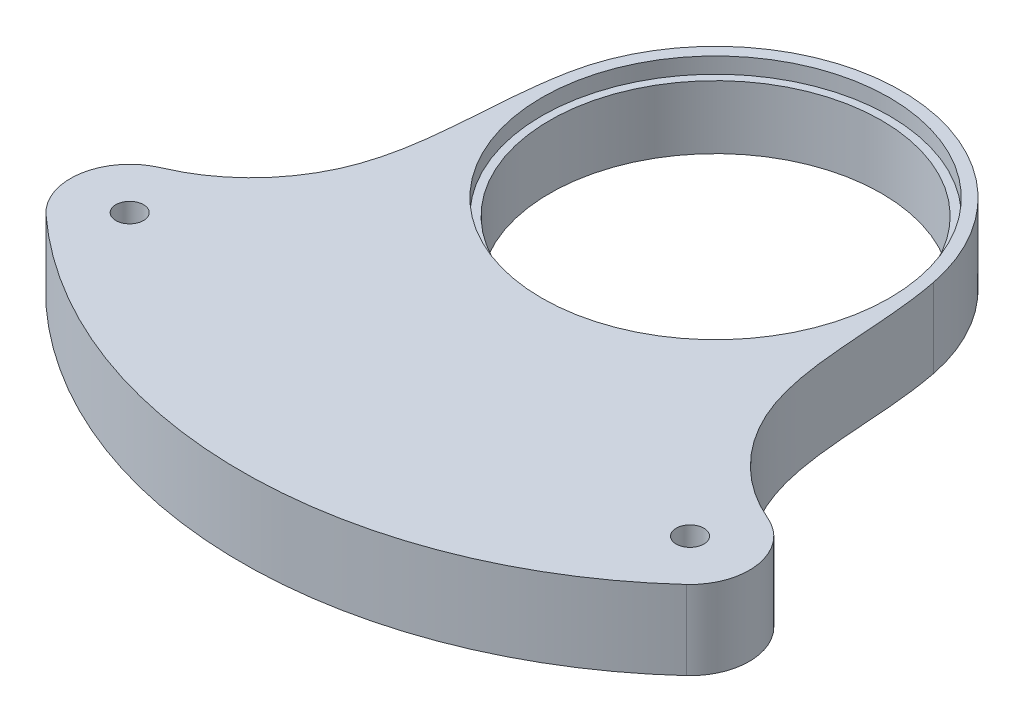
ISO-10303-21;
HEADER;
FILE_DESCRIPTION(('STEP AP214'),'2;1');
FILE_NAME('part.step','',(''),(''),'','','');
FILE_SCHEMA(('AUTOMOTIVE_DESIGN { 1 0 10303 214 1 1 1 1 }'));
ENDSEC;
DATA;
#1=APPLICATION_CONTEXT('core data for automotive mechanical design processes');
#2=APPLICATION_PROTOCOL_DEFINITION('international standard','automotive_design',2000,#1);
#3=PRODUCT_CONTEXT('',#1,'mechanical');
#4=PRODUCT('Part','Part','',(#3));
#5=PRODUCT_RELATED_PRODUCT_CATEGORY('part','',(#4));
#6=PRODUCT_DEFINITION_FORMATION('','',#4);
#7=PRODUCT_DEFINITION_CONTEXT('part definition',#1,'design');
#8=PRODUCT_DEFINITION('design','',#6,#7);
#9=PRODUCT_DEFINITION_SHAPE('','',#8);
#10=(LENGTH_UNIT() NAMED_UNIT(*) SI_UNIT(.MILLI.,.METRE.));
#11=(NAMED_UNIT(*) PLANE_ANGLE_UNIT() SI_UNIT($,.RADIAN.));
#12=(NAMED_UNIT(*) SI_UNIT($,.STERADIAN.) SOLID_ANGLE_UNIT());
#13=UNCERTAINTY_MEASURE_WITH_UNIT(LENGTH_MEASURE(1.E-05),#10,'distance_accuracy_value','');
#14=(GEOMETRIC_REPRESENTATION_CONTEXT(3) GLOBAL_UNCERTAINTY_ASSIGNED_CONTEXT((#13)) GLOBAL_UNIT_ASSIGNED_CONTEXT((#10,
#11,#12)) REPRESENTATION_CONTEXT('',''));
#15=CARTESIAN_POINT('',(0.,0.,0.));
#16=DIRECTION('',(0.,0.,1.));
#17=DIRECTION('',(1.,0.,0.));
#18=AXIS2_PLACEMENT_3D('',#15,#16,#17);
#19=CARTESIAN_POINT('',(0.,10.,0.));
#20=DIRECTION('',(0.,-1.,0.));
#21=DIRECTION('',(0.,0.,1.));
#22=AXIS2_PLACEMENT_3D('',#19,#20,#21);
#23=CYLINDRICAL_SURFACE('',#22,21.);
#24=CARTESIAN_POINT('',(0.,0.,0.));
#25=DIRECTION('',(0.,-1.,0.));
#26=DIRECTION('',(0.,0.,-1.));
#27=AXIS2_PLACEMENT_3D('',#24,#25,#26);
#28=CIRCLE('',#27,21.);
#29=CARTESIAN_POINT('',(0.,0.,-21.));
#30=VERTEX_POINT('',#29);
#31=EDGE_CURVE('E136',#30,#30,#28,.T.);
#32=ORIENTED_EDGE('',*,*,#31,.T.);
#33=EDGE_LOOP('',(#32));
#34=FACE_BOUND('',#33,.T.);
#35=CARTESIAN_POINT('',(0.,8.,0.));
#36=DIRECTION('',(0.,-1.,0.));
#37=DIRECTION('',(0.,0.,-1.));
#38=AXIS2_PLACEMENT_3D('',#35,#36,#37);
#39=CIRCLE('',#38,21.);
#40=CARTESIAN_POINT('',(0.,8.,-21.));
#41=VERTEX_POINT('',#40);
#42=EDGE_CURVE('E49',#41,#41,#39,.T.);
#43=ORIENTED_EDGE('',*,*,#42,.F.);
#44=EDGE_LOOP('',(#43));
#45=FACE_BOUND('',#44,.T.);
#46=ADVANCED_FACE('F45',(#34,#45),#23,.F.);
#47=CARTESIAN_POINT('',(35.4684858998222,10.,38.7070601825314));
#48=DIRECTION('',(0.,-1.,0.));
#49=DIRECTION('',(0.,0.,1.));
#50=AXIS2_PLACEMENT_3D('',#47,#48,#49);
#51=CYLINDRICAL_SURFACE('',#50,7.5);
#52=CARTESIAN_POINT('',(35.4684858998222,0.,38.7070601825314));
#53=DIRECTION('',(0.,-1.,0.));
#54=DIRECTION('',(0.,0.,-1.));
#55=AXIS2_PLACEMENT_3D('',#52,#53,#54);
#56=CIRCLE('',#55,7.5);
#57=CARTESIAN_POINT('',(40.5354124569397,0.,44.2366402086074));
#58=VERTEX_POINT('',#57);
#59=CARTESIAN_POINT('',(38.3914416962393,0.,31.8000833176367));
#60=VERTEX_POINT('',#59);
#61=EDGE_CURVE('E229',#58,#60,#56,.F.);
#62=ORIENTED_EDGE('',*,*,#61,.T.);
#63=DIRECTION('',(0.,-1.,0.));
#64=VECTOR('',#63,1.);
#65=CARTESIAN_POINT('',(38.3914416962393,10.,31.8000833176367));
#66=LINE('',#65,#64);
#67=CARTESIAN_POINT('',(38.3914416962393,10.,31.8000833176367));
#68=VERTEX_POINT('',#67);
#69=EDGE_CURVE('E11',#68,#60,#66,.T.);
#70=ORIENTED_EDGE('',*,*,#69,.F.);
#71=CARTESIAN_POINT('',(35.4684858998222,10.,38.7070601825314));
#72=DIRECTION('',(0.,-1.,0.));
#73=DIRECTION('',(0.,0.,-1.));
#74=AXIS2_PLACEMENT_3D('',#71,#72,#73);
#75=CIRCLE('',#74,7.5);
#76=CARTESIAN_POINT('',(40.5354124569397,10.,44.2366402086074));
#77=VERTEX_POINT('',#76);
#78=EDGE_CURVE('E161',#77,#68,#75,.F.);
#79=ORIENTED_EDGE('',*,*,#78,.F.);
#80=DIRECTION('',(0.,-1.,0.));
#81=VECTOR('',#80,1.);
#82=CARTESIAN_POINT('',(40.5354124569397,10.,44.2366402086074));
#83=LINE('',#82,#81);
#84=EDGE_CURVE('E55',#77,#58,#83,.T.);
#85=ORIENTED_EDGE('',*,*,#84,.T.);
#86=EDGE_LOOP('',(#62,#70,#79,#85));
#87=FACE_BOUND('',#86,.T.);
#88=ADVANCED_FACE('F172',(#87),#51,.T.);
#89=CARTESIAN_POINT('',(0.,10.,0.));
#90=DIRECTION('',(0.,-1.,0.));
#91=DIRECTION('',(0.,0.,1.));
#92=AXIS2_PLACEMENT_3D('',#89,#90,#91);
#93=CYLINDRICAL_SURFACE('',#92,60.);
#94=CARTESIAN_POINT('',(0.,0.,0.));
#95=DIRECTION('',(0.,-1.,0.));
#96=DIRECTION('',(0.,0.,-1.));
#97=AXIS2_PLACEMENT_3D('',#94,#95,#96);
#98=CIRCLE('',#97,60.);
#99=CARTESIAN_POINT('',(-40.5354124569397,0.,44.2366402086074));
#100=VERTEX_POINT('',#99);
#101=EDGE_CURVE('E235',#58,#100,#98,.T.);
#102=ORIENTED_EDGE('',*,*,#101,.F.);
#103=ORIENTED_EDGE('',*,*,#84,.F.);
#104=CARTESIAN_POINT('',(0.,10.,0.));
#105=DIRECTION('',(0.,-1.,0.));
#106=DIRECTION('',(0.,0.,-1.));
#107=AXIS2_PLACEMENT_3D('',#104,#105,#106);
#108=CIRCLE('',#107,60.);
#109=CARTESIAN_POINT('',(-40.5354124569397,10.,44.2366402086074));
#110=VERTEX_POINT('',#109);
#111=EDGE_CURVE('E123',#77,#110,#108,.T.);
#112=ORIENTED_EDGE('',*,*,#111,.T.);
#113=DIRECTION('',(0.,-1.,0.));
#114=VECTOR('',#113,1.);
#115=CARTESIAN_POINT('',(-40.5354124569397,10.,44.2366402086074));
#116=LINE('',#115,#114);
#117=EDGE_CURVE('E112',#110,#100,#116,.T.);
#118=ORIENTED_EDGE('',*,*,#117,.T.);
#119=EDGE_LOOP('',(#102,#103,#112,#118));
#120=FACE_BOUND('',#119,.T.);
#121=ADVANCED_FACE('F180',(#120),#93,.T.);
#122=CARTESIAN_POINT('',(-38.3914416962393,10.,31.8000833176367));
#123=CARTESIAN_POINT('',(-33.2385117120019,10.,29.619420654278));
#124=CARTESIAN_POINT('',(-22.8877745060292,10.,18.7431878157552));
#125=CARTESIAN_POINT('',(-24.7890708541409,10.,4.26895721663629));
#126=CARTESIAN_POINT('',(-23.0586272785893,10.,-4.53317857877841));
#127=B_SPLINE_CURVE_WITH_KNOTS('',3,(#122,#123,#124,#125,#126),.UNSPECIFIED.,.F.,.F.,(4,1,4),
(0.,0.37855644600462,1.),.UNSPECIFIED.);
#128=DIRECTION('',(0.,-1.,0.));
#129=VECTOR('',#128,1.);
#130=SURFACE_OF_LINEAR_EXTRUSION('',#127,#129);
#131=CARTESIAN_POINT('',(-38.3914416962393,0.,31.8000833176367));
#132=CARTESIAN_POINT('',(-33.2385117120019,0.,29.619420654278));
#133=CARTESIAN_POINT('',(-22.8877745060292,0.,18.7431878157552));
#134=CARTESIAN_POINT('',(-24.7890708541409,0.,4.26895721663629));
#135=CARTESIAN_POINT('',(-23.0586272785893,0.,-4.53317857877841));
#136=B_SPLINE_CURVE_WITH_KNOTS('',3,(#131,#132,#133,#134,#135),.UNSPECIFIED.,.F.,.F.,(4,1,4),
(0.,0.37855644600462,1.),.UNSPECIFIED.);
#137=CARTESIAN_POINT('',(-38.3914416962393,0.,31.8000833176367));
#138=VERTEX_POINT('',#137);
#139=CARTESIAN_POINT('',(-23.0586272785893,0.,-4.53317857877841));
#140=VERTEX_POINT('',#139);
#141=EDGE_CURVE('E126',#138,#140,#136,.T.);
#142=ORIENTED_EDGE('',*,*,#141,.F.);
#143=DIRECTION('',(0.,-1.,0.));
#144=VECTOR('',#143,1.);
#145=CARTESIAN_POINT('',(-38.3914416962393,10.,31.8000833176367));
#146=LINE('',#145,#144);
#147=CARTESIAN_POINT('',(-38.3914416962393,10.,31.8000833176367));
#148=VERTEX_POINT('',#147);
#149=EDGE_CURVE('E109',#148,#138,#146,.T.);
#150=ORIENTED_EDGE('',*,*,#149,.F.);
#151=CARTESIAN_POINT('',(-23.0586272785893,10.,-4.53317857877841));
#152=VERTEX_POINT('',#151);
#153=EDGE_CURVE('E119',#148,#152,#127,.T.);
#154=ORIENTED_EDGE('',*,*,#153,.T.);
#155=DIRECTION('',(0.,-1.,0.));
#156=VECTOR('',#155,1.);
#157=CARTESIAN_POINT('',(-23.0586272785893,10.,-4.53317857877841));
#158=LINE('',#157,#156);
#159=EDGE_CURVE('E127',#152,#140,#158,.T.);
#160=ORIENTED_EDGE('',*,*,#159,.T.);
#161=EDGE_LOOP('',(#142,#150,#154,#160));
#162=FACE_BOUND('',#161,.T.);
#163=ADVANCED_FACE('F125',(#162),#130,.T.);
#164=CARTESIAN_POINT('',(38.3914416962393,10.,31.8000833176367));
#165=CARTESIAN_POINT('',(33.2385117120019,10.,29.619420654278));
#166=CARTESIAN_POINT('',(22.8877745060292,10.,18.7431878157552));
#167=CARTESIAN_POINT('',(24.7890708541409,10.,4.26895721663629));
#168=CARTESIAN_POINT('',(23.0586272785893,10.,-4.53317857877841));
#169=B_SPLINE_CURVE_WITH_KNOTS('',3,(#164,#165,#166,#167,#168),.UNSPECIFIED.,.F.,.F.,(4,1,4),
(0.,0.37855644600462,1.),.UNSPECIFIED.);
#170=DIRECTION('',(0.,-1.,0.));
#171=VECTOR('',#170,1.);
#172=SURFACE_OF_LINEAR_EXTRUSION('',#169,#171);
#173=CARTESIAN_POINT('',(38.3914416962393,0.,31.8000833176367));
#174=CARTESIAN_POINT('',(33.2385117120019,0.,29.619420654278));
#175=CARTESIAN_POINT('',(22.8877745060292,0.,18.7431878157552));
#176=CARTESIAN_POINT('',(24.7890708541409,0.,4.26895721663629));
#177=CARTESIAN_POINT('',(23.0586272785893,0.,-4.53317857877841));
#178=B_SPLINE_CURVE_WITH_KNOTS('',3,(#173,#174,#175,#176,#177),.UNSPECIFIED.,.F.,.F.,(4,1,4),
(0.,0.37855644600462,1.),.UNSPECIFIED.);
#179=CARTESIAN_POINT('',(23.0586272785893,0.,-4.53317857877841));
#180=VERTEX_POINT('',#179);
#181=EDGE_CURVE('E115',#60,#180,#178,.T.);
#182=ORIENTED_EDGE('',*,*,#181,.T.);
#183=DIRECTION('',(0.,-1.,0.));
#184=VECTOR('',#183,1.);
#185=CARTESIAN_POINT('',(23.0586272785893,10.,-4.53317857877841));
#186=LINE('',#185,#184);
#187=CARTESIAN_POINT('',(23.0586272785893,10.,-4.53317857877841));
#188=VERTEX_POINT('',#187);
#189=EDGE_CURVE('E122',#188,#180,#186,.T.);
#190=ORIENTED_EDGE('',*,*,#189,.F.);
#191=EDGE_CURVE('E94',#68,#188,#169,.T.);
#192=ORIENTED_EDGE('',*,*,#191,.F.);
#193=ORIENTED_EDGE('',*,*,#69,.T.);
#194=EDGE_LOOP('',(#182,#190,#192,#193));
#195=FACE_BOUND('',#194,.T.);
#196=ADVANCED_FACE('F167',(#195),#172,.F.);
#197=CARTESIAN_POINT('',(0.,0.,0.));
#198=DIRECTION('',(0.,1.,0.));
#199=DIRECTION('',(0.,0.,-1.));
#200=AXIS2_PLACEMENT_3D('',#197,#198,#199);
#201=PLANE('',#200);
#202=CARTESIAN_POINT('',(-35.4684858998222,0.,38.7070601825314));
#203=DIRECTION('',(0.,-1.,0.));
#204=DIRECTION('',(0.,0.,-1.));
#205=AXIS2_PLACEMENT_3D('',#202,#203,#204);
#206=CIRCLE('',#205,1.75);
#207=CARTESIAN_POINT('',(-35.4684858998222,0.,36.9570601825314));
#208=VERTEX_POINT('',#207);
#209=EDGE_CURVE('E139',#208,#208,#206,.F.);
#210=ORIENTED_EDGE('',*,*,#209,.T.);
#211=EDGE_LOOP('',(#210));
#212=FACE_BOUND('',#211,.T.);
#213=CARTESIAN_POINT('',(35.4684858998222,0.,38.7070601825314));
#214=DIRECTION('',(0.,-1.,0.));
#215=DIRECTION('',(0.,0.,-1.));
#216=AXIS2_PLACEMENT_3D('',#213,#214,#215);
#217=CIRCLE('',#216,1.75);
#218=CARTESIAN_POINT('',(35.4684858998222,0.,36.9570601825314));
#219=VERTEX_POINT('',#218);
#220=EDGE_CURVE('E152',#219,#219,#217,.F.);
#221=ORIENTED_EDGE('',*,*,#220,.T.);
#222=EDGE_LOOP('',(#221));
#223=FACE_BOUND('',#222,.T.);
#224=CARTESIAN_POINT('',(-35.4684858998222,0.,38.7070601825314));
#225=DIRECTION('',(0.,-1.,0.));
#226=DIRECTION('',(0.,0.,-1.));
#227=AXIS2_PLACEMENT_3D('',#224,#225,#226);
#228=CIRCLE('',#227,7.5);
#229=EDGE_CURVE('E116',#100,#138,#228,.T.);
#230=ORIENTED_EDGE('',*,*,#229,.T.);
#231=ORIENTED_EDGE('',*,*,#141,.T.);
#232=CARTESIAN_POINT('',(0.,0.,0.));
#233=DIRECTION('',(0.,-1.,0.));
#234=DIRECTION('',(0.,0.,-1.));
#235=AXIS2_PLACEMENT_3D('',#232,#233,#234);
#236=CIRCLE('',#235,23.5);
#237=EDGE_CURVE('E84',#140,#180,#236,.T.);
#238=ORIENTED_EDGE('',*,*,#237,.T.);
#239=ORIENTED_EDGE('',*,*,#181,.F.);
#240=ORIENTED_EDGE('',*,*,#61,.F.);
#241=ORIENTED_EDGE('',*,*,#101,.T.);
#242=EDGE_LOOP('',(#230,#231,#238,#239,#240,#241));
#243=FACE_BOUND('',#242,.T.);
#244=ORIENTED_EDGE('',*,*,#31,.F.);
#245=EDGE_LOOP('',(#244));
#246=FACE_BOUND('',#245,.T.);
#247=ADVANCED_FACE('F171',(#212,#223,#243,#246),#201,.F.);
#248=CARTESIAN_POINT('',(0.,10.,0.));
#249=DIRECTION('',(0.,1.,0.));
#250=DIRECTION('',(0.,0.,-1.));
#251=AXIS2_PLACEMENT_3D('',#248,#249,#250);
#252=PLANE('',#251);
#253=CARTESIAN_POINT('',(0.,10.,0.));
#254=DIRECTION('',(0.,-1.,0.));
#255=DIRECTION('',(0.,0.,-1.));
#256=AXIS2_PLACEMENT_3D('',#253,#254,#255);
#257=CIRCLE('',#256,22.);
#258=CARTESIAN_POINT('',(0.,10.,-22.));
#259=VERTEX_POINT('',#258);
#260=EDGE_CURVE('E188',#259,#259,#257,.T.);
#261=ORIENTED_EDGE('',*,*,#260,.T.);
#262=EDGE_LOOP('',(#261));
#263=FACE_BOUND('',#262,.T.);
#264=CARTESIAN_POINT('',(-35.4684858998222,10.,38.7070601825314));
#265=DIRECTION('',(0.,-1.,0.));
#266=DIRECTION('',(0.,0.,-1.));
#267=AXIS2_PLACEMENT_3D('',#264,#265,#266);
#268=CIRCLE('',#267,1.75);
#269=CARTESIAN_POINT('',(-35.4684858998222,10.,36.9570601825314));
#270=VERTEX_POINT('',#269);
#271=EDGE_CURVE('E143',#270,#270,#268,.T.);
#272=ORIENTED_EDGE('',*,*,#271,.T.);
#273=EDGE_LOOP('',(#272));
#274=FACE_BOUND('',#273,.T.);
#275=CARTESIAN_POINT('',(35.4684858998222,10.,38.7070601825314));
#276=DIRECTION('',(0.,-1.,0.));
#277=DIRECTION('',(0.,0.,1.));
#278=AXIS2_PLACEMENT_3D('',#275,#276,#277);
#279=CIRCLE('',#278,1.75);
#280=CARTESIAN_POINT('',(35.4684858998222,10.,40.4570601825314));
#281=VERTEX_POINT('',#280);
#282=EDGE_CURVE('E148',#281,#281,#279,.T.);
#283=ORIENTED_EDGE('',*,*,#282,.T.);
#284=EDGE_LOOP('',(#283));
#285=FACE_BOUND('',#284,.T.);
#286=ORIENTED_EDGE('',*,*,#111,.F.);
#287=ORIENTED_EDGE('',*,*,#78,.T.);
#288=ORIENTED_EDGE('',*,*,#191,.T.);
#289=CARTESIAN_POINT('',(0.,10.,0.));
#290=DIRECTION('',(0.,-1.,0.));
#291=DIRECTION('',(0.,0.,-1.));
#292=AXIS2_PLACEMENT_3D('',#289,#290,#291);
#293=CIRCLE('',#292,23.5);
#294=EDGE_CURVE('E64',#152,#188,#293,.T.);
#295=ORIENTED_EDGE('',*,*,#294,.F.);
#296=ORIENTED_EDGE('',*,*,#153,.F.);
#297=CARTESIAN_POINT('',(-35.4684858998222,10.,38.7070601825314));
#298=DIRECTION('',(0.,-1.,0.));
#299=DIRECTION('',(0.,0.,-1.));
#300=AXIS2_PLACEMENT_3D('',#297,#298,#299);
#301=CIRCLE('',#300,7.5);
#302=EDGE_CURVE('E105',#110,#148,#301,.T.);
#303=ORIENTED_EDGE('',*,*,#302,.F.);
#304=EDGE_LOOP('',(#286,#287,#288,#295,#296,#303));
#305=FACE_BOUND('',#304,.T.);
#306=ADVANCED_FACE('F120',(#263,#274,#285,#305),#252,.T.);
#307=CARTESIAN_POINT('',(0.,10.,0.));
#308=DIRECTION('',(0.,-1.,0.));
#309=DIRECTION('',(0.,0.,1.));
#310=AXIS2_PLACEMENT_3D('',#307,#308,#309);
#311=CYLINDRICAL_SURFACE('',#310,23.5);
#312=ORIENTED_EDGE('',*,*,#189,.T.);
#313=ORIENTED_EDGE('',*,*,#237,.F.);
#314=ORIENTED_EDGE('',*,*,#159,.F.);
#315=ORIENTED_EDGE('',*,*,#294,.T.);
#316=EDGE_LOOP('',(#312,#313,#314,#315));
#317=FACE_BOUND('',#316,.T.);
#318=ADVANCED_FACE('F47',(#317),#311,.T.);
#319=CARTESIAN_POINT('',(-35.4684858998222,10.,38.7070601825314));
#320=DIRECTION('',(0.,-1.,0.));
#321=DIRECTION('',(0.,0.,1.));
#322=AXIS2_PLACEMENT_3D('',#319,#320,#321);
#323=CYLINDRICAL_SURFACE('',#322,7.5);
#324=ORIENTED_EDGE('',*,*,#149,.T.);
#325=ORIENTED_EDGE('',*,*,#229,.F.);
#326=ORIENTED_EDGE('',*,*,#117,.F.);
#327=ORIENTED_EDGE('',*,*,#302,.T.);
#328=EDGE_LOOP('',(#324,#325,#326,#327));
#329=FACE_BOUND('',#328,.T.);
#330=ADVANCED_FACE('F107',(#329),#323,.T.);
#331=CARTESIAN_POINT('',(35.4684858998222,-0.000999999999999265,38.7070601825314));
#332=DIRECTION('',(0.,1.,0.));
#333=DIRECTION('',(0.,0.,-1.));
#334=AXIS2_PLACEMENT_3D('',#331,#332,#333);
#335=CYLINDRICAL_SURFACE('',#334,1.75);
#336=ORIENTED_EDGE('',*,*,#282,.F.);
#337=EDGE_LOOP('',(#336));
#338=FACE_BOUND('',#337,.T.);
#339=ORIENTED_EDGE('',*,*,#220,.F.);
#340=EDGE_LOOP('',(#339));
#341=FACE_BOUND('',#340,.T.);
#342=ADVANCED_FACE('F175',(#338,#341),#335,.F.);
#343=CARTESIAN_POINT('',(-35.4684858998222,-0.000999999999999265,38.7070601825314));
#344=DIRECTION('',(0.,1.,0.));
#345=DIRECTION('',(0.,0.,-1.));
#346=AXIS2_PLACEMENT_3D('',#343,#344,#345);
#347=CYLINDRICAL_SURFACE('',#346,1.75);
#348=ORIENTED_EDGE('',*,*,#271,.F.);
#349=EDGE_LOOP('',(#348));
#350=FACE_BOUND('',#349,.T.);
#351=ORIENTED_EDGE('',*,*,#209,.F.);
#352=EDGE_LOOP('',(#351));
#353=FACE_BOUND('',#352,.T.);
#354=ADVANCED_FACE('F200',(#350,#353),#347,.F.);
#355=CARTESIAN_POINT('',(0.,8.,0.));
#356=DIRECTION('',(0.,1.,0.));
#357=DIRECTION('',(0.,0.,-1.));
#358=AXIS2_PLACEMENT_3D('',#355,#356,#357);
#359=CYLINDRICAL_SURFACE('',#358,22.);
#360=CARTESIAN_POINT('',(0.,8.,0.));
#361=DIRECTION('',(0.,-1.,0.));
#362=DIRECTION('',(0.,0.,-1.));
#363=AXIS2_PLACEMENT_3D('',#360,#361,#362);
#364=CIRCLE('',#363,22.);
#365=CARTESIAN_POINT('',(0.,8.,-22.));
#366=VERTEX_POINT('',#365);
#367=EDGE_CURVE('E186',#366,#366,#364,.T.);
#368=ORIENTED_EDGE('',*,*,#367,.T.);
#369=EDGE_LOOP('',(#368));
#370=FACE_BOUND('',#369,.T.);
#371=ORIENTED_EDGE('',*,*,#260,.F.);
#372=EDGE_LOOP('',(#371));
#373=FACE_BOUND('',#372,.T.);
#374=ADVANCED_FACE('F197',(#370,#373),#359,.F.);
#375=CARTESIAN_POINT('',(0.,8.,0.));
#376=DIRECTION('',(0.,1.,0.));
#377=DIRECTION('',(0.,0.,-1.));
#378=AXIS2_PLACEMENT_3D('',#375,#376,#377);
#379=PLANE('',#378);
#380=ORIENTED_EDGE('',*,*,#42,.T.);
#381=EDGE_LOOP('',(#380));
#382=FACE_BOUND('',#381,.T.);
#383=ORIENTED_EDGE('',*,*,#367,.F.);
#384=EDGE_LOOP('',(#383));
#385=FACE_BOUND('',#384,.T.);
#386=ADVANCED_FACE('F199',(#382,#385),#379,.T.);
#387=CLOSED_SHELL('',(#46,#88,#121,#163,#196,#247,#306,#318,#330,#342,#354,#374,#386));
#388=MANIFOLD_SOLID_BREP('B2',#387);
#389=ADVANCED_BREP_SHAPE_REPRESENTATION('',(#18,#388),#14);
#390=SHAPE_DEFINITION_REPRESENTATION(#9,#389);
ENDSEC;
END-ISO-10303-21;
